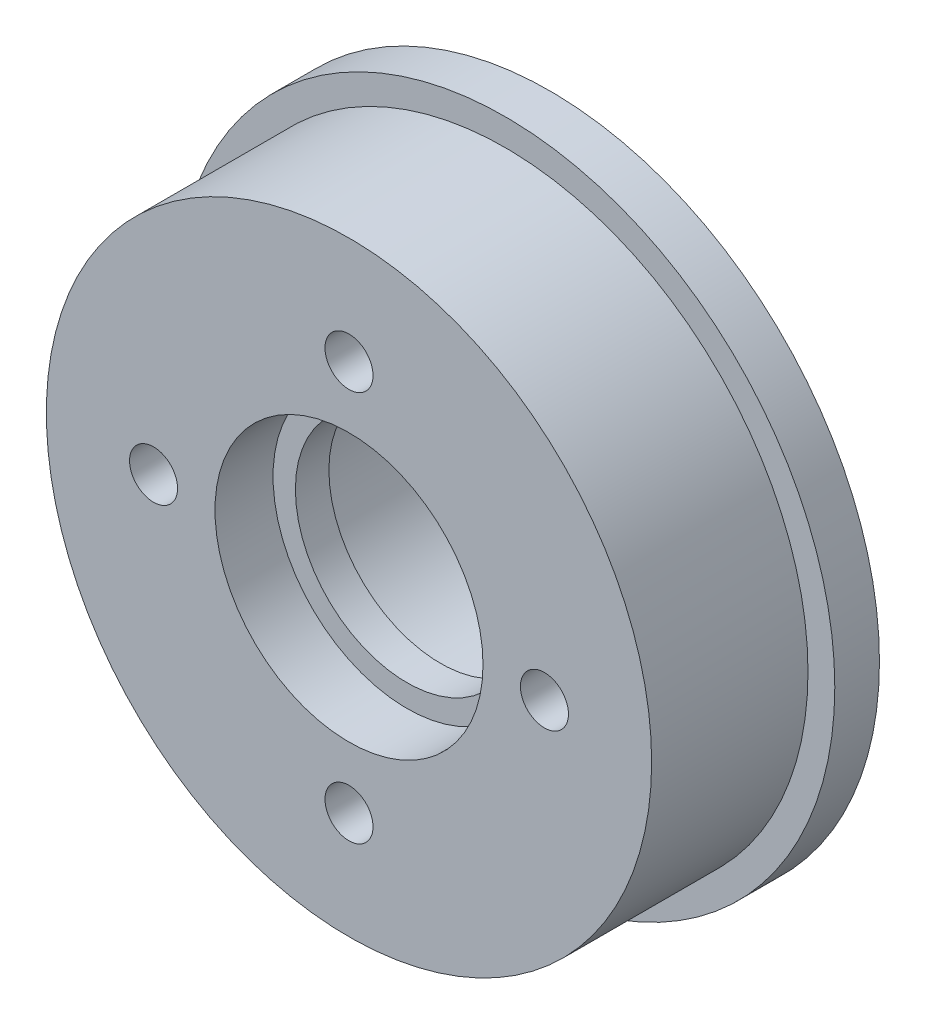
ISO-10303-21;
HEADER;
FILE_DESCRIPTION(('STEP AP214'),'2;1');
FILE_NAME('part.step','',(''),(''),'','','');
FILE_SCHEMA(('AUTOMOTIVE_DESIGN { 1 0 10303 214 1 1 1 1 }'));
ENDSEC;
DATA;
#1=APPLICATION_CONTEXT('core data for automotive mechanical design processes');
#2=APPLICATION_PROTOCOL_DEFINITION('international standard','automotive_design',2000,#1);
#3=PRODUCT_CONTEXT('',#1,'mechanical');
#4=PRODUCT('Part','Part','',(#3));
#5=PRODUCT_RELATED_PRODUCT_CATEGORY('part','',(#4));
#6=PRODUCT_DEFINITION_FORMATION('','',#4);
#7=PRODUCT_DEFINITION_CONTEXT('part definition',#1,'design');
#8=PRODUCT_DEFINITION('design','',#6,#7);
#9=PRODUCT_DEFINITION_SHAPE('','',#8);
#10=(LENGTH_UNIT() NAMED_UNIT(*) SI_UNIT(.MILLI.,.METRE.));
#11=(NAMED_UNIT(*) PLANE_ANGLE_UNIT() SI_UNIT($,.RADIAN.));
#12=(NAMED_UNIT(*) SI_UNIT($,.STERADIAN.) SOLID_ANGLE_UNIT());
#13=UNCERTAINTY_MEASURE_WITH_UNIT(LENGTH_MEASURE(1.E-05),#10,'distance_accuracy_value','');
#14=(GEOMETRIC_REPRESENTATION_CONTEXT(3) GLOBAL_UNCERTAINTY_ASSIGNED_CONTEXT((#13)) GLOBAL_UNIT_ASSIGNED_CONTEXT((#10,
#11,#12)) REPRESENTATION_CONTEXT('',''));
#15=CARTESIAN_POINT('',(0.,0.,0.));
#16=DIRECTION('',(0.,0.,1.));
#17=DIRECTION('',(1.,0.,0.));
#18=AXIS2_PLACEMENT_3D('',#15,#16,#17);
#19=CARTESIAN_POINT('',(0.,0.,18.));
#20=DIRECTION('',(0.,0.,-1.));
#21=DIRECTION('',(-1.,0.,0.));
#22=AXIS2_PLACEMENT_3D('',#19,#20,#21);
#23=CYLINDRICAL_SURFACE('',#22,12.);
#24=CARTESIAN_POINT('',(0.,0.,0.));
#25=DIRECTION('',(0.,0.,1.));
#26=DIRECTION('',(1.,0.,0.));
#27=AXIS2_PLACEMENT_3D('',#24,#25,#26);
#28=CIRCLE('',#27,12.);
#29=CARTESIAN_POINT('',(12.,0.,0.));
#30=VERTEX_POINT('',#29);
#31=EDGE_CURVE('E62',#30,#30,#28,.T.);
#32=ORIENTED_EDGE('',*,*,#31,.F.);
#33=EDGE_LOOP('',(#32));
#34=FACE_BOUND('',#33,.T.);
#35=CARTESIAN_POINT('',(0.,0.,9.8));
#36=DIRECTION('',(0.,0.,1.));
#37=DIRECTION('',(1.,0.,0.));
#38=AXIS2_PLACEMENT_3D('',#35,#36,#37);
#39=CIRCLE('',#38,12.);
#40=CARTESIAN_POINT('',(12.,0.,9.8));
#41=VERTEX_POINT('',#40);
#42=EDGE_CURVE('E70',#41,#41,#39,.T.);
#43=ORIENTED_EDGE('',*,*,#42,.T.);
#44=EDGE_LOOP('',(#43));
#45=FACE_BOUND('',#44,.T.);
#46=ADVANCED_FACE('F33',(#34,#45),#23,.F.);
#47=CARTESIAN_POINT('',(0.,0.,4.));
#48=DIRECTION('',(0.,0.,-1.));
#49=DIRECTION('',(-1.,0.,0.));
#50=AXIS2_PLACEMENT_3D('',#47,#48,#49);
#51=CYLINDRICAL_SURFACE('',#50,29.5);
#52=CARTESIAN_POINT('',(0.,0.,4.));
#53=DIRECTION('',(0.,0.,1.));
#54=DIRECTION('',(1.,0.,0.));
#55=AXIS2_PLACEMENT_3D('',#52,#53,#54);
#56=CIRCLE('',#55,29.5);
#57=CARTESIAN_POINT('',(29.5,0.,4.));
#58=VERTEX_POINT('',#57);
#59=EDGE_CURVE('E40',#58,#58,#56,.T.);
#60=ORIENTED_EDGE('',*,*,#59,.F.);
#61=EDGE_LOOP('',(#60));
#62=FACE_BOUND('',#61,.T.);
#63=CARTESIAN_POINT('',(0.,0.,0.));
#64=DIRECTION('',(0.,0.,1.));
#65=DIRECTION('',(1.,0.,0.));
#66=AXIS2_PLACEMENT_3D('',#63,#64,#65);
#67=CIRCLE('',#66,29.5);
#68=CARTESIAN_POINT('',(29.5,0.,0.));
#69=VERTEX_POINT('',#68);
#70=EDGE_CURVE('E49',#69,#69,#67,.T.);
#71=ORIENTED_EDGE('',*,*,#70,.T.);
#72=EDGE_LOOP('',(#71));
#73=FACE_BOUND('',#72,.T.);
#74=ADVANCED_FACE('F35',(#62,#73),#51,.T.);
#75=CARTESIAN_POINT('',(0.,0.,4.));
#76=DIRECTION('',(0.,0.,1.));
#77=DIRECTION('',(1.,0.,0.));
#78=AXIS2_PLACEMENT_3D('',#75,#76,#77);
#79=PLANE('',#78);
#80=CARTESIAN_POINT('',(0.,0.,4.));
#81=DIRECTION('',(0.,0.,1.));
#82=DIRECTION('',(1.,0.,0.));
#83=AXIS2_PLACEMENT_3D('',#80,#81,#82);
#84=CIRCLE('',#83,27.1);
#85=CARTESIAN_POINT('',(27.1,0.,4.));
#86=VERTEX_POINT('',#85);
#87=EDGE_CURVE('E44',#86,#86,#84,.T.);
#88=ORIENTED_EDGE('',*,*,#87,.F.);
#89=EDGE_LOOP('',(#88));
#90=FACE_BOUND('',#89,.T.);
#91=ORIENTED_EDGE('',*,*,#59,.T.);
#92=EDGE_LOOP('',(#91));
#93=FACE_BOUND('',#92,.T.);
#94=ADVANCED_FACE('F132',(#90,#93),#79,.T.);
#95=CARTESIAN_POINT('',(0.,0.,0.));
#96=DIRECTION('',(0.,0.,1.));
#97=DIRECTION('',(1.,0.,0.));
#98=AXIS2_PLACEMENT_3D('',#95,#96,#97);
#99=PLANE('',#98);
#100=ORIENTED_EDGE('',*,*,#70,.F.);
#101=EDGE_LOOP('',(#100));
#102=FACE_BOUND('',#101,.T.);
#103=ORIENTED_EDGE('',*,*,#31,.T.);
#104=EDGE_LOOP('',(#103));
#105=FACE_BOUND('',#104,.T.);
#106=ADVANCED_FACE('F123',(#102,#105),#99,.F.);
#107=CARTESIAN_POINT('',(0.,0.,12.8));
#108=DIRECTION('',(0.,0.,1.));
#109=DIRECTION('',(1.,0.,0.));
#110=AXIS2_PLACEMENT_3D('',#107,#108,#109);
#111=CIRCLE('',#110,12.);
#112=CARTESIAN_POINT('',(12.,0.,12.8));
#113=VERTEX_POINT('',#112);
#114=EDGE_CURVE('E10',#113,#113,#111,.T.);
#115=ORIENTED_EDGE('',*,*,#114,.F.);
#116=EDGE_LOOP('',(#115));
#117=FACE_BOUND('',#116,.T.);
#118=CARTESIAN_POINT('',(0.,0.,18.));
#119=DIRECTION('',(0.,0.,1.));
#120=DIRECTION('',(1.,0.,0.));
#121=AXIS2_PLACEMENT_3D('',#118,#119,#120);
#122=CIRCLE('',#121,12.);
#123=CARTESIAN_POINT('',(12.,0.,18.));
#124=VERTEX_POINT('',#123);
#125=EDGE_CURVE('E57',#124,#124,#122,.T.);
#126=ORIENTED_EDGE('',*,*,#125,.T.);
#127=EDGE_LOOP('',(#126));
#128=FACE_BOUND('',#127,.T.);
#129=ADVANCED_FACE('F121',(#117,#128),#23,.F.);
#130=CARTESIAN_POINT('',(0.,0.,18.));
#131=DIRECTION('',(0.,0.,-1.));
#132=DIRECTION('',(-1.,0.,0.));
#133=AXIS2_PLACEMENT_3D('',#130,#131,#132);
#134=CYLINDRICAL_SURFACE('',#133,27.1);
#135=ORIENTED_EDGE('',*,*,#87,.T.);
#136=EDGE_LOOP('',(#135));
#137=FACE_BOUND('',#136,.T.);
#138=CARTESIAN_POINT('',(0.,0.,18.));
#139=DIRECTION('',(0.,0.,1.));
#140=DIRECTION('',(1.,0.,0.));
#141=AXIS2_PLACEMENT_3D('',#138,#139,#140);
#142=CIRCLE('',#141,27.1);
#143=CARTESIAN_POINT('',(27.1,0.,18.));
#144=VERTEX_POINT('',#143);
#145=EDGE_CURVE('E53',#144,#144,#142,.T.);
#146=ORIENTED_EDGE('',*,*,#145,.F.);
#147=EDGE_LOOP('',(#146));
#148=FACE_BOUND('',#147,.T.);
#149=ADVANCED_FACE('F116',(#137,#148),#134,.T.);
#150=CARTESIAN_POINT('',(0.,0.,18.));
#151=DIRECTION('',(0.,0.,1.));
#152=DIRECTION('',(1.,0.,0.));
#153=AXIS2_PLACEMENT_3D('',#150,#151,#152);
#154=PLANE('',#153);
#155=CARTESIAN_POINT('',(0.,17.5,18.));
#156=DIRECTION('',(0.,0.,1.));
#157=DIRECTION('',(1.,0.,0.));
#158=AXIS2_PLACEMENT_3D('',#155,#156,#157);
#159=CIRCLE('',#158,2.15);
#160=CARTESIAN_POINT('',(2.15,17.5,18.));
#161=VERTEX_POINT('',#160);
#162=EDGE_CURVE('E85',#161,#161,#159,.T.);
#163=ORIENTED_EDGE('',*,*,#162,.F.);
#164=EDGE_LOOP('',(#163));
#165=FACE_BOUND('',#164,.T.);
#166=CARTESIAN_POINT('',(17.5,0.,18.));
#167=DIRECTION('',(0.,0.,1.));
#168=DIRECTION('',(1.,0.,0.));
#169=AXIS2_PLACEMENT_3D('',#166,#167,#168);
#170=CIRCLE('',#169,2.15);
#171=CARTESIAN_POINT('',(19.65,0.,18.));
#172=VERTEX_POINT('',#171);
#173=EDGE_CURVE('E95',#172,#172,#170,.T.);
#174=ORIENTED_EDGE('',*,*,#173,.F.);
#175=EDGE_LOOP('',(#174));
#176=FACE_BOUND('',#175,.T.);
#177=CARTESIAN_POINT('',(0.,-17.5,18.));
#178=DIRECTION('',(0.,0.,1.));
#179=DIRECTION('',(1.,0.,0.));
#180=AXIS2_PLACEMENT_3D('',#177,#178,#179);
#181=CIRCLE('',#180,2.15);
#182=CARTESIAN_POINT('',(2.15,-17.5,18.));
#183=VERTEX_POINT('',#182);
#184=EDGE_CURVE('E101',#183,#183,#181,.T.);
#185=ORIENTED_EDGE('',*,*,#184,.F.);
#186=EDGE_LOOP('',(#185));
#187=FACE_BOUND('',#186,.T.);
#188=CARTESIAN_POINT('',(-17.5,0.,18.));
#189=DIRECTION('',(0.,0.,1.));
#190=DIRECTION('',(1.,0.,0.));
#191=AXIS2_PLACEMENT_3D('',#188,#189,#190);
#192=CIRCLE('',#191,2.15);
#193=CARTESIAN_POINT('',(-15.35,0.,18.));
#194=VERTEX_POINT('',#193);
#195=EDGE_CURVE('E78',#194,#194,#192,.T.);
#196=ORIENTED_EDGE('',*,*,#195,.F.);
#197=EDGE_LOOP('',(#196));
#198=FACE_BOUND('',#197,.T.);
#199=ORIENTED_EDGE('',*,*,#125,.F.);
#200=EDGE_LOOP('',(#199));
#201=FACE_BOUND('',#200,.T.);
#202=ORIENTED_EDGE('',*,*,#145,.T.);
#203=EDGE_LOOP('',(#202));
#204=FACE_BOUND('',#203,.T.);
#205=ADVANCED_FACE('F112',(#165,#176,#187,#198,#201,#204),#154,.T.);
#206=CARTESIAN_POINT('',(0.,0.,12.8));
#207=DIRECTION('',(0.,0.,-1.));
#208=DIRECTION('',(-1.,0.,0.));
#209=AXIS2_PLACEMENT_3D('',#206,#207,#208);
#210=CYLINDRICAL_SURFACE('',#209,10.);
#211=CARTESIAN_POINT('',(0.,0.,12.8));
#212=DIRECTION('',(0.,0.,1.));
#213=DIRECTION('',(1.,0.,0.));
#214=AXIS2_PLACEMENT_3D('',#211,#212,#213);
#215=CIRCLE('',#214,10.);
#216=CARTESIAN_POINT('',(10.,0.,12.8));
#217=VERTEX_POINT('',#216);
#218=EDGE_CURVE('E66',#217,#217,#215,.T.);
#219=ORIENTED_EDGE('',*,*,#218,.T.);
#220=EDGE_LOOP('',(#219));
#221=FACE_BOUND('',#220,.T.);
#222=CARTESIAN_POINT('',(0.,0.,9.8));
#223=DIRECTION('',(0.,0.,1.));
#224=DIRECTION('',(1.,0.,0.));
#225=AXIS2_PLACEMENT_3D('',#222,#223,#224);
#226=CIRCLE('',#225,10.);
#227=CARTESIAN_POINT('',(10.,0.,9.8));
#228=VERTEX_POINT('',#227);
#229=EDGE_CURVE('E75',#228,#228,#226,.T.);
#230=ORIENTED_EDGE('',*,*,#229,.F.);
#231=EDGE_LOOP('',(#230));
#232=FACE_BOUND('',#231,.T.);
#233=ADVANCED_FACE('F115',(#221,#232),#210,.F.);
#234=CARTESIAN_POINT('',(0.,0.,12.8));
#235=DIRECTION('',(0.,0.,1.));
#236=DIRECTION('',(1.,0.,0.));
#237=AXIS2_PLACEMENT_3D('',#234,#235,#236);
#238=PLANE('',#237);
#239=ORIENTED_EDGE('',*,*,#218,.F.);
#240=EDGE_LOOP('',(#239));
#241=FACE_BOUND('',#240,.T.);
#242=ORIENTED_EDGE('',*,*,#114,.T.);
#243=EDGE_LOOP('',(#242));
#244=FACE_BOUND('',#243,.T.);
#245=ADVANCED_FACE('F146',(#241,#244),#238,.T.);
#246=CARTESIAN_POINT('',(0.,0.,9.8));
#247=DIRECTION('',(0.,0.,1.));
#248=DIRECTION('',(1.,0.,0.));
#249=AXIS2_PLACEMENT_3D('',#246,#247,#248);
#250=PLANE('',#249);
#251=ORIENTED_EDGE('',*,*,#229,.T.);
#252=EDGE_LOOP('',(#251));
#253=FACE_BOUND('',#252,.T.);
#254=ORIENTED_EDGE('',*,*,#42,.F.);
#255=EDGE_LOOP('',(#254));
#256=FACE_BOUND('',#255,.T.);
#257=ADVANCED_FACE('F144',(#253,#256),#250,.F.);
#258=CARTESIAN_POINT('',(-17.5,0.,12.));
#259=DIRECTION('',(0.,0.,1.));
#260=DIRECTION('',(1.,0.,0.));
#261=AXIS2_PLACEMENT_3D('',#258,#259,#260);
#262=CYLINDRICAL_SURFACE('',#261,2.15);
#263=CARTESIAN_POINT('',(-17.5,0.,12.));
#264=DIRECTION('',(0.,0.,1.));
#265=DIRECTION('',(1.,0.,0.));
#266=AXIS2_PLACEMENT_3D('',#263,#264,#265);
#267=CIRCLE('',#266,2.15);
#268=CARTESIAN_POINT('',(-15.35,0.,12.));
#269=VERTEX_POINT('',#268);
#270=EDGE_CURVE('E103',#269,#269,#267,.T.);
#271=ORIENTED_EDGE('',*,*,#270,.F.);
#272=EDGE_LOOP('',(#271));
#273=FACE_BOUND('',#272,.T.);
#274=ORIENTED_EDGE('',*,*,#195,.T.);
#275=EDGE_LOOP('',(#274));
#276=FACE_BOUND('',#275,.T.);
#277=ADVANCED_FACE('F110',(#273,#276),#262,.F.);
#278=CARTESIAN_POINT('',(-17.5,0.,12.));
#279=DIRECTION('',(0.,0.,1.));
#280=DIRECTION('',(1.,0.,0.));
#281=AXIS2_PLACEMENT_3D('',#278,#279,#280);
#282=PLANE('',#281);
#283=ORIENTED_EDGE('',*,*,#270,.T.);
#284=EDGE_LOOP('',(#283));
#285=FACE_BOUND('',#284,.T.);
#286=ADVANCED_FACE('F152',(#285),#282,.T.);
#287=CARTESIAN_POINT('',(0.,-17.5,12.));
#288=DIRECTION('',(0.,0.,1.));
#289=DIRECTION('',(1.,0.,0.));
#290=AXIS2_PLACEMENT_3D('',#287,#288,#289);
#291=CYLINDRICAL_SURFACE('',#290,2.15);
#292=CARTESIAN_POINT('',(0.,-17.5,12.));
#293=DIRECTION('',(0.,0.,1.));
#294=DIRECTION('',(1.,0.,0.));
#295=AXIS2_PLACEMENT_3D('',#292,#293,#294);
#296=CIRCLE('',#295,2.15);
#297=CARTESIAN_POINT('',(2.15,-17.5,12.));
#298=VERTEX_POINT('',#297);
#299=EDGE_CURVE('E98',#298,#298,#296,.T.);
#300=ORIENTED_EDGE('',*,*,#299,.F.);
#301=EDGE_LOOP('',(#300));
#302=FACE_BOUND('',#301,.T.);
#303=ORIENTED_EDGE('',*,*,#184,.T.);
#304=EDGE_LOOP('',(#303));
#305=FACE_BOUND('',#304,.T.);
#306=ADVANCED_FACE('F193',(#302,#305),#291,.F.);
#307=CARTESIAN_POINT('',(0.,-17.5,12.));
#308=DIRECTION('',(0.,0.,1.));
#309=DIRECTION('',(1.,0.,0.));
#310=AXIS2_PLACEMENT_3D('',#307,#308,#309);
#311=PLANE('',#310);
#312=ORIENTED_EDGE('',*,*,#299,.T.);
#313=EDGE_LOOP('',(#312));
#314=FACE_BOUND('',#313,.T.);
#315=ADVANCED_FACE('F202',(#314),#311,.T.);
#316=CARTESIAN_POINT('',(17.5,0.,12.));
#317=DIRECTION('',(0.,0.,1.));
#318=DIRECTION('',(1.,0.,0.));
#319=AXIS2_PLACEMENT_3D('',#316,#317,#318);
#320=CYLINDRICAL_SURFACE('',#319,2.15);
#321=CARTESIAN_POINT('',(17.5,0.,12.));
#322=DIRECTION('',(0.,0.,1.));
#323=DIRECTION('',(1.,0.,0.));
#324=AXIS2_PLACEMENT_3D('',#321,#322,#323);
#325=CIRCLE('',#324,2.15);
#326=CARTESIAN_POINT('',(19.65,0.,12.));
#327=VERTEX_POINT('',#326);
#328=EDGE_CURVE('E90',#327,#327,#325,.T.);
#329=ORIENTED_EDGE('',*,*,#328,.F.);
#330=EDGE_LOOP('',(#329));
#331=FACE_BOUND('',#330,.T.);
#332=ORIENTED_EDGE('',*,*,#173,.T.);
#333=EDGE_LOOP('',(#332));
#334=FACE_BOUND('',#333,.T.);
#335=ADVANCED_FACE('F212',(#331,#334),#320,.F.);
#336=CARTESIAN_POINT('',(17.5,0.,12.));
#337=DIRECTION('',(0.,0.,1.));
#338=DIRECTION('',(1.,0.,0.));
#339=AXIS2_PLACEMENT_3D('',#336,#337,#338);
#340=PLANE('',#339);
#341=ORIENTED_EDGE('',*,*,#328,.T.);
#342=EDGE_LOOP('',(#341));
#343=FACE_BOUND('',#342,.T.);
#344=ADVANCED_FACE('F222',(#343),#340,.T.);
#345=CARTESIAN_POINT('',(0.,17.5,12.));
#346=DIRECTION('',(0.,0.,1.));
#347=DIRECTION('',(1.,0.,0.));
#348=AXIS2_PLACEMENT_3D('',#345,#346,#347);
#349=CYLINDRICAL_SURFACE('',#348,2.15);
#350=CARTESIAN_POINT('',(0.,17.5,12.));
#351=DIRECTION('',(0.,0.,1.));
#352=DIRECTION('',(1.,0.,0.));
#353=AXIS2_PLACEMENT_3D('',#350,#351,#352);
#354=CIRCLE('',#353,2.15);
#355=CARTESIAN_POINT('',(2.15,17.5,12.));
#356=VERTEX_POINT('',#355);
#357=EDGE_CURVE('E81',#356,#356,#354,.T.);
#358=ORIENTED_EDGE('',*,*,#357,.F.);
#359=EDGE_LOOP('',(#358));
#360=FACE_BOUND('',#359,.T.);
#361=ORIENTED_EDGE('',*,*,#162,.T.);
#362=EDGE_LOOP('',(#361));
#363=FACE_BOUND('',#362,.T.);
#364=ADVANCED_FACE('F232',(#360,#363),#349,.F.);
#365=CARTESIAN_POINT('',(0.,17.5,12.));
#366=DIRECTION('',(0.,0.,1.));
#367=DIRECTION('',(1.,0.,0.));
#368=AXIS2_PLACEMENT_3D('',#365,#366,#367);
#369=PLANE('',#368);
#370=ORIENTED_EDGE('',*,*,#357,.T.);
#371=EDGE_LOOP('',(#370));
#372=FACE_BOUND('',#371,.T.);
#373=ADVANCED_FACE('F242',(#372),#369,.T.);
#374=CLOSED_SHELL('',(#46,#74,#94,#106,#129,#149,#205,#233,#245,#257,#277,#286,#306,#315,#335,
#344,#364,#373));
#375=MANIFOLD_SOLID_BREP('B2',#374);
#376=ADVANCED_BREP_SHAPE_REPRESENTATION('',(#18,#375),#14);
#377=SHAPE_DEFINITION_REPRESENTATION(#9,#376);
ENDSEC;
END-ISO-10303-21;
